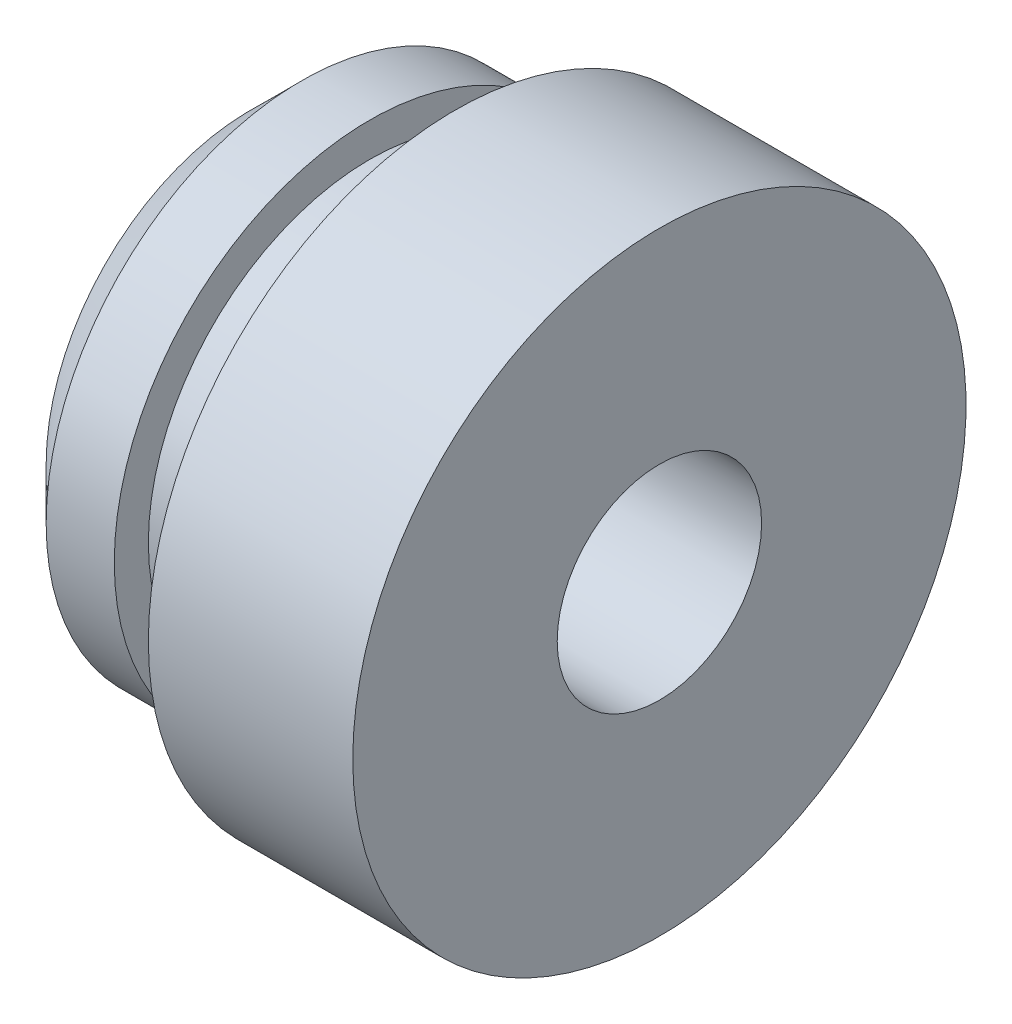
ISO-10303-21;
HEADER;
FILE_DESCRIPTION(('STEP AP214'),'2;1');
FILE_NAME('part.step','',(''),(''),'','','');
FILE_SCHEMA(('AUTOMOTIVE_DESIGN { 1 0 10303 214 1 1 1 1 }'));
ENDSEC;
DATA;
#1=APPLICATION_CONTEXT('core data for automotive mechanical design processes');
#2=APPLICATION_PROTOCOL_DEFINITION('international standard','automotive_design',2000,#1);
#3=PRODUCT_CONTEXT('',#1,'mechanical');
#4=PRODUCT('Part','Part','',(#3));
#5=PRODUCT_RELATED_PRODUCT_CATEGORY('part','',(#4));
#6=PRODUCT_DEFINITION_FORMATION('','',#4);
#7=PRODUCT_DEFINITION_CONTEXT('part definition',#1,'design');
#8=PRODUCT_DEFINITION('design','',#6,#7);
#9=PRODUCT_DEFINITION_SHAPE('','',#8);
#10=(LENGTH_UNIT() NAMED_UNIT(*) SI_UNIT(.MILLI.,.METRE.));
#11=(NAMED_UNIT(*) PLANE_ANGLE_UNIT() SI_UNIT($,.RADIAN.));
#12=(NAMED_UNIT(*) SI_UNIT($,.STERADIAN.) SOLID_ANGLE_UNIT());
#13=UNCERTAINTY_MEASURE_WITH_UNIT(LENGTH_MEASURE(1.E-05),#10,'distance_accuracy_value','');
#14=(GEOMETRIC_REPRESENTATION_CONTEXT(3) GLOBAL_UNCERTAINTY_ASSIGNED_CONTEXT((#13)) GLOBAL_UNIT_ASSIGNED_CONTEXT((#10,
#11,#12)) REPRESENTATION_CONTEXT('',''));
#15=CARTESIAN_POINT('',(0.,0.,0.));
#16=DIRECTION('',(0.,0.,1.));
#17=DIRECTION('',(1.,0.,0.));
#18=AXIS2_PLACEMENT_3D('',#15,#16,#17);
#19=CARTESIAN_POINT('',(1296.80373354463,988.830990537081,0.));
#20=DIRECTION('',(1.,0.,0.));
#21=DIRECTION('',(0.,0.,-1.));
#22=AXIS2_PLACEMENT_3D('',#19,#20,#21);
#23=PLANE('',#22);
#24=CARTESIAN_POINT('',(1296.80373354463,979.830990537081,0.));
#25=DIRECTION('',(-1.,0.,0.));
#26=DIRECTION('',(0.,0.,1.));
#27=AXIS2_PLACEMENT_3D('',#24,#25,#26);
#28=CIRCLE('',#27,6.49999999999995);
#29=CARTESIAN_POINT('',(1296.80373354463,979.830990537081,6.49999999999995));
#30=VERTEX_POINT('',#29);
#31=EDGE_CURVE('E10',#30,#30,#28,.T.);
#32=ORIENTED_EDGE('',*,*,#31,.F.);
#33=EDGE_LOOP('',(#32));
#34=FACE_BOUND('',#33,.T.);
#35=CARTESIAN_POINT('',(1296.80373354463,979.830990537081,0.));
#36=DIRECTION('',(-1.,0.,0.));
#37=DIRECTION('',(0.,0.,1.));
#38=AXIS2_PLACEMENT_3D('',#35,#36,#37);
#39=CIRCLE('',#38,9.00000000000001);
#40=CARTESIAN_POINT('',(1296.80373354463,979.830990537081,9.00000000000001));
#41=VERTEX_POINT('',#40);
#42=EDGE_CURVE('E61',#41,#41,#39,.T.);
#43=ORIENTED_EDGE('',*,*,#42,.T.);
#44=EDGE_LOOP('',(#43));
#45=FACE_BOUND('',#44,.T.);
#46=ADVANCED_FACE('F30',(#34,#45),#23,.F.);
#47=CARTESIAN_POINT('',(1287.33376597222,979.830990537081,0.));
#48=DIRECTION('',(-1.,0.,0.));
#49=DIRECTION('',(0.,0.,1.));
#50=AXIS2_PLACEMENT_3D('',#47,#48,#49);
#51=CYLINDRICAL_SURFACE('',#50,6.49999999999995);
#52=CARTESIAN_POINT('',(1294.30373354463,979.830990537081,0.));
#53=DIRECTION('',(-1.,0.,0.));
#54=DIRECTION('',(0.,0.,1.));
#55=AXIS2_PLACEMENT_3D('',#52,#53,#54);
#56=CIRCLE('',#55,6.49999999999995);
#57=CARTESIAN_POINT('',(1294.30373354463,979.830990537081,6.49999999999995));
#58=VERTEX_POINT('',#57);
#59=EDGE_CURVE('E36',#58,#58,#56,.T.);
#60=ORIENTED_EDGE('',*,*,#59,.F.);
#61=EDGE_LOOP('',(#60));
#62=FACE_BOUND('',#61,.T.);
#63=ORIENTED_EDGE('',*,*,#31,.T.);
#64=EDGE_LOOP('',(#63));
#65=FACE_BOUND('',#64,.T.);
#66=ADVANCED_FACE('F95',(#62,#65),#51,.T.);
#67=CARTESIAN_POINT('',(1294.30373354463,987.330990537081,0.));
#68=DIRECTION('',(-1.,0.,0.));
#69=DIRECTION('',(0.,0.,1.));
#70=AXIS2_PLACEMENT_3D('',#67,#68,#69);
#71=PLANE('',#70);
#72=CARTESIAN_POINT('',(1294.30373354463,979.830990537081,0.));
#73=DIRECTION('',(-1.,0.,0.));
#74=DIRECTION('',(0.,0.,1.));
#75=AXIS2_PLACEMENT_3D('',#72,#73,#74);
#76=CIRCLE('',#75,7.50000000000006);
#77=CARTESIAN_POINT('',(1294.30373354463,979.830990537081,7.50000000000006));
#78=VERTEX_POINT('',#77);
#79=EDGE_CURVE('E40',#78,#78,#76,.T.);
#80=ORIENTED_EDGE('',*,*,#79,.F.);
#81=EDGE_LOOP('',(#80));
#82=FACE_BOUND('',#81,.T.);
#83=ORIENTED_EDGE('',*,*,#59,.T.);
#84=EDGE_LOOP('',(#83));
#85=FACE_BOUND('',#84,.T.);
#86=ADVANCED_FACE('F100',(#82,#85),#71,.F.);
#87=CARTESIAN_POINT('',(1287.33376597222,979.830990537081,0.));
#88=DIRECTION('',(-1.,0.,0.));
#89=DIRECTION('',(0.,0.,1.));
#90=AXIS2_PLACEMENT_3D('',#87,#88,#89);
#91=CYLINDRICAL_SURFACE('',#90,7.50000000000006);
#92=CARTESIAN_POINT('',(1292.30373354463,979.830990537081,0.));
#93=DIRECTION('',(-1.,0.,0.));
#94=DIRECTION('',(0.,0.,1.));
#95=AXIS2_PLACEMENT_3D('',#92,#93,#94);
#96=CIRCLE('',#95,7.50000000000006);
#97=CARTESIAN_POINT('',(1292.30373354463,979.830990537081,7.50000000000006));
#98=VERTEX_POINT('',#97);
#99=EDGE_CURVE('E44',#98,#98,#96,.T.);
#100=ORIENTED_EDGE('',*,*,#99,.F.);
#101=EDGE_LOOP('',(#100));
#102=FACE_BOUND('',#101,.T.);
#103=ORIENTED_EDGE('',*,*,#79,.T.);
#104=EDGE_LOOP('',(#103));
#105=FACE_BOUND('',#104,.T.);
#106=ADVANCED_FACE('F105',(#102,#105),#91,.T.);
#107=CARTESIAN_POINT('',(1292.30373354463,979.830990537081,0.));
#108=DIRECTION('',(1.,0.,0.));
#109=DIRECTION('',(0.,0.,-1.));
#110=AXIS2_PLACEMENT_3D('',#107,#108,#109);
#111=CONICAL_SURFACE('',#110,7.50000000000006,0.785398163397522);
#112=CARTESIAN_POINT('',(1290.80373354463,979.830990537081,0.));
#113=DIRECTION('',(-1.,0.,0.));
#114=DIRECTION('',(0.,0.,1.));
#115=AXIS2_PLACEMENT_3D('',#112,#113,#114);
#116=CIRCLE('',#115,6.00000000000001);
#117=CARTESIAN_POINT('',(1290.80373354463,979.830990537081,6.00000000000001));
#118=VERTEX_POINT('',#117);
#119=EDGE_CURVE('E49',#118,#118,#116,.T.);
#120=ORIENTED_EDGE('',*,*,#119,.F.);
#121=EDGE_LOOP('',(#120));
#122=FACE_BOUND('',#121,.T.);
#123=ORIENTED_EDGE('',*,*,#99,.T.);
#124=EDGE_LOOP('',(#123));
#125=FACE_BOUND('',#124,.T.);
#126=ADVANCED_FACE('F91',(#122,#125),#111,.T.);
#127=CARTESIAN_POINT('',(1290.80373354463,985.830990537081,0.));
#128=DIRECTION('',(1.,0.,0.));
#129=DIRECTION('',(0.,0.,-1.));
#130=AXIS2_PLACEMENT_3D('',#127,#128,#129);
#131=PLANE('',#130);
#132=ORIENTED_EDGE('',*,*,#119,.T.);
#133=EDGE_LOOP('',(#132));
#134=FACE_BOUND('',#133,.T.);
#135=ADVANCED_FACE('F86',(#134),#131,.F.);
#136=CARTESIAN_POINT('',(1295.20373354463,982.830990537081,0.));
#137=DIRECTION('',(-1.,0.,0.));
#138=DIRECTION('',(0.,0.,1.));
#139=AXIS2_PLACEMENT_3D('',#136,#137,#138);
#140=PLANE('',#139);
#141=CARTESIAN_POINT('',(1295.20373354463,979.830990537081,0.));
#142=DIRECTION('',(-1.,0.,0.));
#143=DIRECTION('',(0.,0.,1.));
#144=AXIS2_PLACEMENT_3D('',#141,#142,#143);
#145=CIRCLE('',#144,3.);
#146=CARTESIAN_POINT('',(1295.20373354463,979.830990537081,3.));
#147=VERTEX_POINT('',#146);
#148=EDGE_CURVE('E52',#147,#147,#145,.T.);
#149=ORIENTED_EDGE('',*,*,#148,.F.);
#150=EDGE_LOOP('',(#149));
#151=FACE_BOUND('',#150,.T.);
#152=ADVANCED_FACE('F81',(#151),#140,.F.);
#153=CARTESIAN_POINT('',(1287.33376597222,979.830990537081,0.));
#154=DIRECTION('',(-1.,0.,0.));
#155=DIRECTION('',(0.,0.,1.));
#156=AXIS2_PLACEMENT_3D('',#153,#154,#155);
#157=CYLINDRICAL_SURFACE('',#156,3.);
#158=CARTESIAN_POINT('',(1302.80373354463,979.830990537081,0.));
#159=DIRECTION('',(-1.,0.,0.));
#160=DIRECTION('',(0.,0.,1.));
#161=AXIS2_PLACEMENT_3D('',#158,#159,#160);
#162=CIRCLE('',#161,3.);
#163=CARTESIAN_POINT('',(1302.80373354463,979.830990537081,3.));
#164=VERTEX_POINT('',#163);
#165=EDGE_CURVE('E55',#164,#164,#162,.T.);
#166=ORIENTED_EDGE('',*,*,#165,.F.);
#167=EDGE_LOOP('',(#166));
#168=FACE_BOUND('',#167,.T.);
#169=ORIENTED_EDGE('',*,*,#148,.T.);
#170=EDGE_LOOP('',(#169));
#171=FACE_BOUND('',#170,.T.);
#172=ADVANCED_FACE('F75',(#168,#171),#157,.F.);
#173=CARTESIAN_POINT('',(1302.80373354463,988.830990537081,0.));
#174=DIRECTION('',(-1.,0.,0.));
#175=DIRECTION('',(0.,0.,1.));
#176=AXIS2_PLACEMENT_3D('',#173,#174,#175);
#177=PLANE('',#176);
#178=CARTESIAN_POINT('',(1302.80373354463,979.830990537081,0.));
#179=DIRECTION('',(-1.,0.,0.));
#180=DIRECTION('',(0.,0.,1.));
#181=AXIS2_PLACEMENT_3D('',#178,#179,#180);
#182=CIRCLE('',#181,9.00000000000001);
#183=CARTESIAN_POINT('',(1302.80373354463,979.830990537081,9.00000000000001));
#184=VERTEX_POINT('',#183);
#185=EDGE_CURVE('E58',#184,#184,#182,.T.);
#186=ORIENTED_EDGE('',*,*,#185,.F.);
#187=EDGE_LOOP('',(#186));
#188=FACE_BOUND('',#187,.T.);
#189=ORIENTED_EDGE('',*,*,#165,.T.);
#190=EDGE_LOOP('',(#189));
#191=FACE_BOUND('',#190,.T.);
#192=ADVANCED_FACE('F69',(#188,#191),#177,.F.);
#193=CARTESIAN_POINT('',(1287.33376597222,979.830990537081,0.));
#194=DIRECTION('',(-1.,0.,0.));
#195=DIRECTION('',(0.,0.,1.));
#196=AXIS2_PLACEMENT_3D('',#193,#194,#195);
#197=CYLINDRICAL_SURFACE('',#196,9.00000000000001);
#198=ORIENTED_EDGE('',*,*,#42,.F.);
#199=EDGE_LOOP('',(#198));
#200=FACE_BOUND('',#199,.T.);
#201=ORIENTED_EDGE('',*,*,#185,.T.);
#202=EDGE_LOOP('',(#201));
#203=FACE_BOUND('',#202,.T.);
#204=ADVANCED_FACE('F66',(#200,#203),#197,.T.);
#205=CLOSED_SHELL('',(#46,#66,#86,#106,#126,#135,#152,#172,#192,#204));
#206=MANIFOLD_SOLID_BREP('B2',#205);
#207=ADVANCED_BREP_SHAPE_REPRESENTATION('',(#18,#206),#14);
#208=SHAPE_DEFINITION_REPRESENTATION(#9,#207);
ENDSEC;
END-ISO-10303-21;
